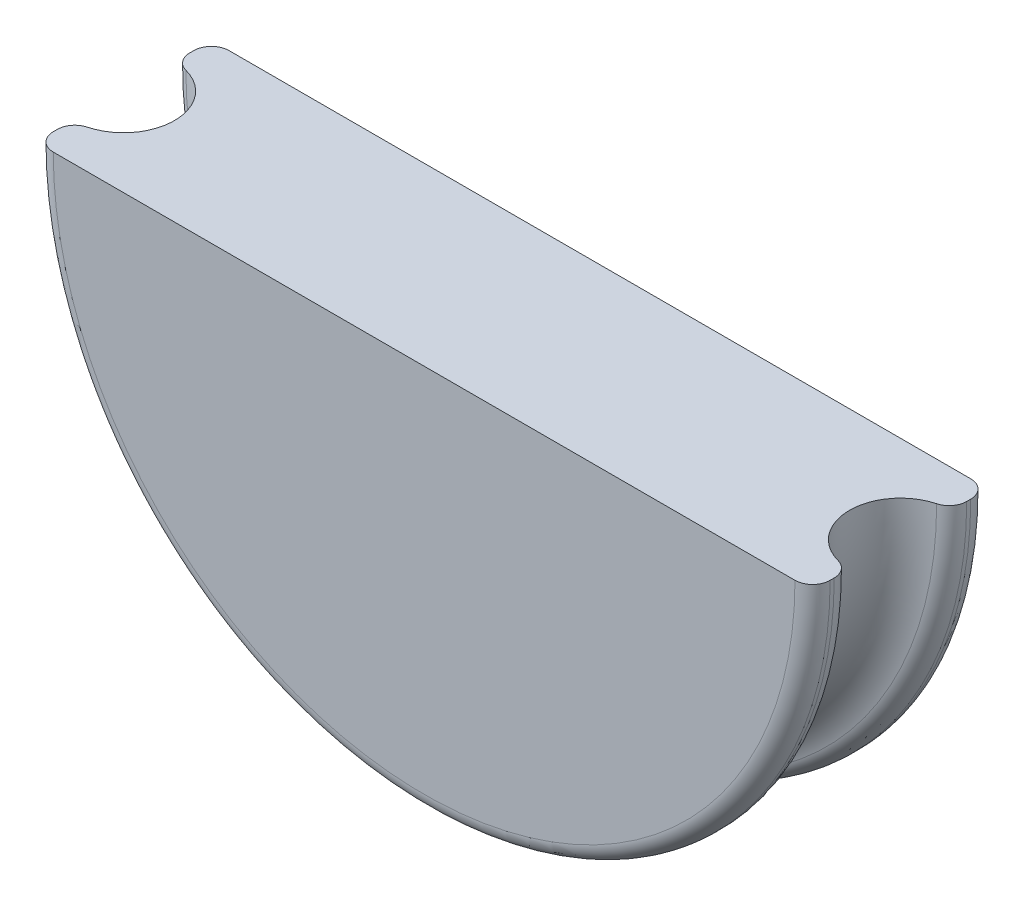
ISO-10303-21;
HEADER;
FILE_DESCRIPTION(('STEP AP214'),'2;1');
FILE_NAME('part.step','',(''),(''),'','','');
FILE_SCHEMA(('AUTOMOTIVE_DESIGN { 1 0 10303 214 1 1 1 1 }'));
ENDSEC;
DATA;
#1=APPLICATION_CONTEXT('core data for automotive mechanical design processes');
#2=APPLICATION_PROTOCOL_DEFINITION('international standard','automotive_design',2000,#1);
#3=PRODUCT_CONTEXT('',#1,'mechanical');
#4=PRODUCT('Part','Part','',(#3));
#5=PRODUCT_RELATED_PRODUCT_CATEGORY('part','',(#4));
#6=PRODUCT_DEFINITION_FORMATION('','',#4);
#7=PRODUCT_DEFINITION_CONTEXT('part definition',#1,'design');
#8=PRODUCT_DEFINITION('design','',#6,#7);
#9=PRODUCT_DEFINITION_SHAPE('','',#8);
#10=(LENGTH_UNIT() NAMED_UNIT(*) SI_UNIT(.MILLI.,.METRE.));
#11=(NAMED_UNIT(*) PLANE_ANGLE_UNIT() SI_UNIT($,.RADIAN.));
#12=(NAMED_UNIT(*) SI_UNIT($,.STERADIAN.) SOLID_ANGLE_UNIT());
#13=UNCERTAINTY_MEASURE_WITH_UNIT(LENGTH_MEASURE(1.E-05),#10,'distance_accuracy_value','');
#14=(GEOMETRIC_REPRESENTATION_CONTEXT(3) GLOBAL_UNCERTAINTY_ASSIGNED_CONTEXT((#13)) GLOBAL_UNIT_ASSIGNED_CONTEXT((#10,
#11,#12)) REPRESENTATION_CONTEXT('',''));
#15=CARTESIAN_POINT('',(0.,0.,0.));
#16=DIRECTION('',(0.,0.,1.));
#17=DIRECTION('',(1.,0.,0.));
#18=AXIS2_PLACEMENT_3D('',#15,#16,#17);
#19=CARTESIAN_POINT('',(0.,0.,-6.35));
#20=DIRECTION('',(0.,0.,-1.));
#21=DIRECTION('',(-1.,0.,0.));
#22=AXIS2_PLACEMENT_3D('',#19,#20,#21);
#23=PLANE('',#22);
#24=CARTESIAN_POINT('',(0.,0.,-6.35));
#25=DIRECTION('',(0.,0.,1.));
#26=DIRECTION('',(1.,0.,0.));
#27=AXIS2_PLACEMENT_3D('',#24,#25,#26);
#28=CIRCLE('',#27,26.797);
#29=CARTESIAN_POINT('',(-26.797,1.87122450873959E-13,-6.35));
#30=VERTEX_POINT('',#29);
#31=CARTESIAN_POINT('',(26.797,0.,-6.35));
#32=VERTEX_POINT('',#31);
#33=EDGE_CURVE('E11',#30,#32,#28,.T.);
#34=ORIENTED_EDGE('',*,*,#33,.F.);
#35=DIRECTION('',(1.,0.,0.));
#36=VECTOR('',#35,1.);
#37=CARTESIAN_POINT('',(0.,0.,-6.35));
#38=LINE('',#37,#36);
#39=EDGE_CURVE('E118',#30,#32,#38,.T.);
#40=ORIENTED_EDGE('',*,*,#39,.T.);
#41=EDGE_LOOP('',(#34,#40));
#42=FACE_BOUND('',#41,.T.);
#43=ADVANCED_FACE('F43',(#42),#23,.T.);
#44=CARTESIAN_POINT('',(0.,0.,-5.08));
#45=DIRECTION('',(0.,0.,1.));
#46=DIRECTION('',(1.,0.,0.));
#47=AXIS2_PLACEMENT_3D('',#44,#45,#46);
#48=TOROIDAL_SURFACE('',#47,26.797,1.27);
#49=CARTESIAN_POINT('',(0.,0.,-5.08));
#50=DIRECTION('',(0.,0.,1.));
#51=DIRECTION('',(1.,0.,0.));
#52=AXIS2_PLACEMENT_3D('',#49,#50,#51);
#53=CIRCLE('',#52,28.067);
#54=CARTESIAN_POINT('',(-28.067,1.9599081347462E-13,-5.08));
#55=VERTEX_POINT('',#54);
#56=CARTESIAN_POINT('',(28.067,0.,-5.08));
#57=VERTEX_POINT('',#56);
#58=EDGE_CURVE('E51',#55,#57,#53,.T.);
#59=ORIENTED_EDGE('',*,*,#58,.F.);
#60=CARTESIAN_POINT('',(-26.797,1.87122450873959E-13,-5.08));
#61=DIRECTION('',(0.,-1.,0.));
#62=DIRECTION('',(0.,0.,-1.));
#63=AXIS2_PLACEMENT_3D('',#60,#61,#62);
#64=CIRCLE('',#63,1.27);
#65=EDGE_CURVE('E124',#55,#30,#64,.T.);
#66=ORIENTED_EDGE('',*,*,#65,.T.);
#67=ORIENTED_EDGE('',*,*,#33,.T.);
#68=CARTESIAN_POINT('',(26.797,0.,-5.08));
#69=DIRECTION('',(0.,1.,0.));
#70=DIRECTION('',(0.,0.,-1.));
#71=AXIS2_PLACEMENT_3D('',#68,#69,#70);
#72=CIRCLE('',#71,1.27);
#73=EDGE_CURVE('E143',#57,#32,#72,.T.);
#74=ORIENTED_EDGE('',*,*,#73,.F.);
#75=EDGE_LOOP('',(#59,#66,#67,#74));
#76=FACE_BOUND('',#75,.T.);
#77=ADVANCED_FACE('F45',(#76),#48,.T.);
#78=CARTESIAN_POINT('',(0.,0.,6.35));
#79=DIRECTION('',(0.,0.,1.));
#80=DIRECTION('',(1.,0.,0.));
#81=AXIS2_PLACEMENT_3D('',#78,#79,#80);
#82=CYLINDRICAL_SURFACE('',#81,28.067);
#83=CARTESIAN_POINT('',(0.,0.,-4.78741151354256));
#84=DIRECTION('',(0.,0.,1.));
#85=DIRECTION('',(1.,0.,0.));
#86=AXIS2_PLACEMENT_3D('',#83,#84,#85);
#87=CIRCLE('',#86,28.067);
#88=CARTESIAN_POINT('',(-28.067,1.9599081347462E-13,-4.78741151354256));
#89=VERTEX_POINT('',#88);
#90=CARTESIAN_POINT('',(28.067,0.,-4.78741151354256));
#91=VERTEX_POINT('',#90);
#92=EDGE_CURVE('E170',#89,#91,#87,.T.);
#93=ORIENTED_EDGE('',*,*,#92,.F.);
#94=DIRECTION('',(0.,0.,-1.));
#95=VECTOR('',#94,1.);
#96=CARTESIAN_POINT('',(-28.067,1.9599081347462E-13,-5.08));
#97=LINE('',#96,#95);
#98=EDGE_CURVE('E160',#89,#55,#97,.T.);
#99=ORIENTED_EDGE('',*,*,#98,.T.);
#100=ORIENTED_EDGE('',*,*,#58,.T.);
#101=DIRECTION('',(0.,0.,-1.));
#102=VECTOR('',#101,1.);
#103=CARTESIAN_POINT('',(28.067,0.,-5.08));
#104=LINE('',#103,#102);
#105=EDGE_CURVE('E140',#91,#57,#104,.T.);
#106=ORIENTED_EDGE('',*,*,#105,.F.);
#107=EDGE_LOOP('',(#93,#99,#100,#106));
#108=FACE_BOUND('',#107,.T.);
#109=ADVANCED_FACE('F173',(#108),#82,.T.);
#110=CARTESIAN_POINT('',(0.,0.,-4.78741151354256));
#111=DIRECTION('',(0.,0.,1.));
#112=DIRECTION('',(1.,0.,0.));
#113=AXIS2_PLACEMENT_3D('',#110,#111,#112);
#114=TOROIDAL_SURFACE('',#113,26.797,1.27);
#115=CARTESIAN_POINT('',(0.,0.,-3.5598700998137));
#116=DIRECTION('',(0.,0.,1.));
#117=DIRECTION('',(1.,0.,0.));
#118=AXIS2_PLACEMENT_3D('',#115,#116,#117);
#119=CIRCLE('',#118,27.122641025641);
#120=CARTESIAN_POINT('',(-27.122641025641,1.89396390002334E-13,-3.5598700998137));
#121=VERTEX_POINT('',#120);
#122=CARTESIAN_POINT('',(27.122641025641,0.,-3.5598700998137));
#123=VERTEX_POINT('',#122);
#124=EDGE_CURVE('E168',#121,#123,#119,.T.);
#125=ORIENTED_EDGE('',*,*,#124,.F.);
#126=CARTESIAN_POINT('',(-26.797,1.87122450873959E-13,-4.78741151354256));
#127=DIRECTION('',(0.,-1.,0.));
#128=DIRECTION('',(0.,0.,-1.));
#129=AXIS2_PLACEMENT_3D('',#126,#127,#128);
#130=CIRCLE('',#129,1.27);
#131=EDGE_CURVE('E157',#121,#89,#130,.T.);
#132=ORIENTED_EDGE('',*,*,#131,.T.);
#133=ORIENTED_EDGE('',*,*,#92,.T.);
#134=CARTESIAN_POINT('',(26.797,0.,-4.78741151354256));
#135=DIRECTION('',(0.,1.,0.));
#136=DIRECTION('',(0.,0.,-1.));
#137=AXIS2_PLACEMENT_3D('',#134,#135,#136);
#138=CIRCLE('',#137,1.27);
#139=EDGE_CURVE('E137',#123,#91,#138,.T.);
#140=ORIENTED_EDGE('',*,*,#139,.F.);
#141=EDGE_LOOP('',(#125,#132,#133,#140));
#142=FACE_BOUND('',#141,.T.);
#143=ADVANCED_FACE('F199',(#142),#114,.T.);
#144=CARTESIAN_POINT('',(0.,0.,0.));
#145=DIRECTION('',(0.,0.,1.));
#146=DIRECTION('',(1.,0.,0.));
#147=AXIS2_PLACEMENT_3D('',#144,#145,#146);
#148=TOROIDAL_SURFACE('',#147,28.067,3.68299999999999);
#149=CARTESIAN_POINT('',(0.,0.,3.55987009981371));
#150=DIRECTION('',(0.,0.,1.));
#151=DIRECTION('',(1.,0.,0.));
#152=AXIS2_PLACEMENT_3D('',#149,#150,#151);
#153=CIRCLE('',#152,27.122641025641);
#154=CARTESIAN_POINT('',(-27.122641025641,1.89396390002334E-13,3.55987009981371));
#155=VERTEX_POINT('',#154);
#156=CARTESIAN_POINT('',(27.122641025641,0.,3.55987009981371));
#157=VERTEX_POINT('',#156);
#158=EDGE_CURVE('E166',#155,#157,#153,.T.);
#159=ORIENTED_EDGE('',*,*,#158,.F.);
#160=CARTESIAN_POINT('',(-28.067,1.9599081347462E-13,0.));
#161=DIRECTION('',(0.,1.,0.));
#162=DIRECTION('',(0.,0.,1.));
#163=AXIS2_PLACEMENT_3D('',#160,#161,#162);
#164=CIRCLE('',#163,3.68299999999999);
#165=EDGE_CURVE('E154',#155,#121,#164,.T.);
#166=ORIENTED_EDGE('',*,*,#165,.T.);
#167=ORIENTED_EDGE('',*,*,#124,.T.);
#168=CARTESIAN_POINT('',(28.067,0.,0.));
#169=DIRECTION('',(0.,-1.,0.));
#170=DIRECTION('',(0.,0.,1.));
#171=AXIS2_PLACEMENT_3D('',#168,#169,#170);
#172=CIRCLE('',#171,3.68299999999999);
#173=EDGE_CURVE('E134',#157,#123,#172,.T.);
#174=ORIENTED_EDGE('',*,*,#173,.F.);
#175=EDGE_LOOP('',(#159,#166,#167,#174));
#176=FACE_BOUND('',#175,.T.);
#177=ADVANCED_FACE('F195',(#176),#148,.F.);
#178=CARTESIAN_POINT('',(0.,0.,4.78741151354257));
#179=DIRECTION('',(0.,0.,1.));
#180=DIRECTION('',(1.,0.,0.));
#181=AXIS2_PLACEMENT_3D('',#178,#179,#180);
#182=TOROIDAL_SURFACE('',#181,26.797,1.27);
#183=CARTESIAN_POINT('',(0.,0.,4.78741151354257));
#184=DIRECTION('',(0.,0.,1.));
#185=DIRECTION('',(1.,0.,0.));
#186=AXIS2_PLACEMENT_3D('',#183,#184,#185);
#187=CIRCLE('',#186,28.067);
#188=CARTESIAN_POINT('',(-28.067,1.9599081347462E-13,4.78741151354257));
#189=VERTEX_POINT('',#188);
#190=CARTESIAN_POINT('',(28.067,0.,4.78741151354257));
#191=VERTEX_POINT('',#190);
#192=EDGE_CURVE('E164',#189,#191,#187,.T.);
#193=ORIENTED_EDGE('',*,*,#192,.F.);
#194=CARTESIAN_POINT('',(-26.797,1.87122450873959E-13,4.78741151354257));
#195=DIRECTION('',(0.,-1.,0.));
#196=DIRECTION('',(0.,0.,1.));
#197=AXIS2_PLACEMENT_3D('',#194,#195,#196);
#198=CIRCLE('',#197,1.27);
#199=EDGE_CURVE('E151',#189,#155,#198,.T.);
#200=ORIENTED_EDGE('',*,*,#199,.T.);
#201=ORIENTED_EDGE('',*,*,#158,.T.);
#202=CARTESIAN_POINT('',(26.797,0.,4.78741151354257));
#203=DIRECTION('',(0.,1.,0.));
#204=DIRECTION('',(0.,0.,1.));
#205=AXIS2_PLACEMENT_3D('',#202,#203,#204);
#206=CIRCLE('',#205,1.27);
#207=EDGE_CURVE('E129',#191,#157,#206,.T.);
#208=ORIENTED_EDGE('',*,*,#207,.F.);
#209=EDGE_LOOP('',(#193,#200,#201,#208));
#210=FACE_BOUND('',#209,.T.);
#211=ADVANCED_FACE('F191',(#210),#182,.T.);
#212=CARTESIAN_POINT('',(0.,0.,6.35));
#213=DIRECTION('',(0.,0.,1.));
#214=DIRECTION('',(1.,0.,0.));
#215=AXIS2_PLACEMENT_3D('',#212,#213,#214);
#216=CYLINDRICAL_SURFACE('',#215,28.067);
#217=CARTESIAN_POINT('',(0.,0.,5.08));
#218=DIRECTION('',(0.,0.,1.));
#219=DIRECTION('',(1.,0.,0.));
#220=AXIS2_PLACEMENT_3D('',#217,#218,#219);
#221=CIRCLE('',#220,28.067);
#222=CARTESIAN_POINT('',(-28.067,1.9599081347462E-13,5.08));
#223=VERTEX_POINT('',#222);
#224=CARTESIAN_POINT('',(28.067,0.,5.08));
#225=VERTEX_POINT('',#224);
#226=EDGE_CURVE('E123',#223,#225,#221,.T.);
#227=ORIENTED_EDGE('',*,*,#226,.F.);
#228=DIRECTION('',(0.,0.,-1.));
#229=VECTOR('',#228,1.);
#230=CARTESIAN_POINT('',(-28.067,1.9599081347462E-13,5.08));
#231=LINE('',#230,#229);
#232=EDGE_CURVE('E148',#223,#189,#231,.T.);
#233=ORIENTED_EDGE('',*,*,#232,.T.);
#234=ORIENTED_EDGE('',*,*,#192,.T.);
#235=DIRECTION('',(0.,0.,-1.));
#236=VECTOR('',#235,1.);
#237=CARTESIAN_POINT('',(28.067,0.,5.08));
#238=LINE('',#237,#236);
#239=EDGE_CURVE('E127',#225,#191,#238,.T.);
#240=ORIENTED_EDGE('',*,*,#239,.F.);
#241=EDGE_LOOP('',(#227,#233,#234,#240));
#242=FACE_BOUND('',#241,.T.);
#243=ADVANCED_FACE('F188',(#242),#216,.T.);
#244=CARTESIAN_POINT('',(0.,0.,5.08));
#245=DIRECTION('',(0.,0.,1.));
#246=DIRECTION('',(1.,0.,0.));
#247=AXIS2_PLACEMENT_3D('',#244,#245,#246);
#248=TOROIDAL_SURFACE('',#247,26.797,1.27);
#249=CARTESIAN_POINT('',(0.,0.,6.35));
#250=DIRECTION('',(0.,0.,1.));
#251=DIRECTION('',(1.,0.,0.));
#252=AXIS2_PLACEMENT_3D('',#249,#250,#251);
#253=CIRCLE('',#252,26.797);
#254=CARTESIAN_POINT('',(-26.797,1.87122450873959E-13,6.35));
#255=VERTEX_POINT('',#254);
#256=CARTESIAN_POINT('',(26.797,0.,6.35));
#257=VERTEX_POINT('',#256);
#258=EDGE_CURVE('E120',#255,#257,#253,.T.);
#259=ORIENTED_EDGE('',*,*,#258,.F.);
#260=CARTESIAN_POINT('',(-26.797,1.87122450873959E-13,5.08));
#261=DIRECTION('',(0.,-1.,0.));
#262=DIRECTION('',(0.,0.,-1.));
#263=AXIS2_PLACEMENT_3D('',#260,#261,#262);
#264=CIRCLE('',#263,1.27);
#265=EDGE_CURVE('E116',#255,#223,#264,.T.);
#266=ORIENTED_EDGE('',*,*,#265,.T.);
#267=ORIENTED_EDGE('',*,*,#226,.T.);
#268=CARTESIAN_POINT('',(26.797,0.,5.08));
#269=DIRECTION('',(0.,1.,0.));
#270=DIRECTION('',(0.,0.,-1.));
#271=AXIS2_PLACEMENT_3D('',#268,#269,#270);
#272=CIRCLE('',#271,1.27);
#273=EDGE_CURVE('E112',#257,#225,#272,.T.);
#274=ORIENTED_EDGE('',*,*,#273,.F.);
#275=EDGE_LOOP('',(#259,#266,#267,#274));
#276=FACE_BOUND('',#275,.T.);
#277=ADVANCED_FACE('F126',(#276),#248,.T.);
#278=CARTESIAN_POINT('',(0.,0.,6.35));
#279=DIRECTION('',(0.,0.,1.));
#280=DIRECTION('',(1.,0.,0.));
#281=AXIS2_PLACEMENT_3D('',#278,#279,#280);
#282=PLANE('',#281);
#283=ORIENTED_EDGE('',*,*,#258,.T.);
#284=DIRECTION('',(-1.,0.,0.));
#285=VECTOR('',#284,1.);
#286=CARTESIAN_POINT('',(0.,0.,6.35));
#287=LINE('',#286,#285);
#288=EDGE_CURVE('E106',#257,#255,#287,.T.);
#289=ORIENTED_EDGE('',*,*,#288,.T.);
#290=EDGE_LOOP('',(#283,#289));
#291=FACE_BOUND('',#290,.T.);
#292=ADVANCED_FACE('F121',(#291),#282,.T.);
#293=CARTESIAN_POINT('',(-26.797,1.87122450873959E-13,-5.08));
#294=DIRECTION('',(0.,1.,0.));
#295=DIRECTION('',(0.,0.,-1.));
#296=AXIS2_PLACEMENT_3D('',#293,#294,#295);
#297=PLANE('',#296);
#298=ORIENTED_EDGE('',*,*,#39,.F.);
#299=ORIENTED_EDGE('',*,*,#65,.F.);
#300=ORIENTED_EDGE('',*,*,#98,.F.);
#301=ORIENTED_EDGE('',*,*,#131,.F.);
#302=ORIENTED_EDGE('',*,*,#165,.F.);
#303=ORIENTED_EDGE('',*,*,#199,.F.);
#304=ORIENTED_EDGE('',*,*,#232,.F.);
#305=ORIENTED_EDGE('',*,*,#265,.F.);
#306=ORIENTED_EDGE('',*,*,#288,.F.);
#307=ORIENTED_EDGE('',*,*,#273,.T.);
#308=ORIENTED_EDGE('',*,*,#239,.T.);
#309=ORIENTED_EDGE('',*,*,#207,.T.);
#310=ORIENTED_EDGE('',*,*,#173,.T.);
#311=ORIENTED_EDGE('',*,*,#139,.T.);
#312=ORIENTED_EDGE('',*,*,#105,.T.);
#313=ORIENTED_EDGE('',*,*,#73,.T.);
#314=EDGE_LOOP('',(#298,#299,#300,#301,#302,#303,#304,#305,#306,#307,#308,#309,#310,#311,#312,#313));
#315=FACE_BOUND('',#314,.T.);
#316=ADVANCED_FACE('F109',(#315),#297,.T.);
#317=CLOSED_SHELL('',(#43,#77,#109,#143,#177,#211,#243,#277,#292,#316));
#318=MANIFOLD_SOLID_BREP('B2',#317);
#319=ADVANCED_BREP_SHAPE_REPRESENTATION('',(#18,#318),#14);
#320=SHAPE_DEFINITION_REPRESENTATION(#9,#319);
ENDSEC;
END-ISO-10303-21;
